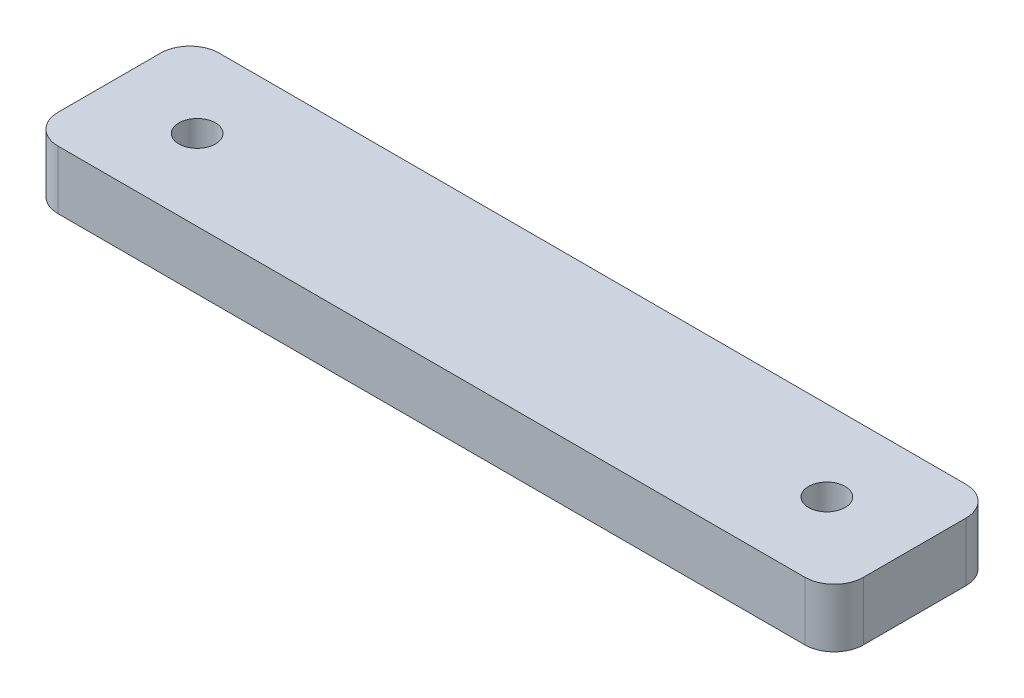
ISO-10303-21;
HEADER;
FILE_DESCRIPTION(('STEP AP214'),'2;1');
FILE_NAME('part.step','',(''),(''),'','','');
FILE_SCHEMA(('AUTOMOTIVE_DESIGN { 1 0 10303 214 1 1 1 1 }'));
ENDSEC;
DATA;
#1=APPLICATION_CONTEXT('core data for automotive mechanical design processes');
#2=APPLICATION_PROTOCOL_DEFINITION('international standard','automotive_design',2000,#1);
#3=PRODUCT_CONTEXT('',#1,'mechanical');
#4=PRODUCT('Part','Part','',(#3));
#5=PRODUCT_RELATED_PRODUCT_CATEGORY('part','',(#4));
#6=PRODUCT_DEFINITION_FORMATION('','',#4);
#7=PRODUCT_DEFINITION_CONTEXT('part definition',#1,'design');
#8=PRODUCT_DEFINITION('design','',#6,#7);
#9=PRODUCT_DEFINITION_SHAPE('','',#8);
#10=(LENGTH_UNIT() NAMED_UNIT(*) SI_UNIT(.MILLI.,.METRE.));
#11=(NAMED_UNIT(*) PLANE_ANGLE_UNIT() SI_UNIT($,.RADIAN.));
#12=(NAMED_UNIT(*) SI_UNIT($,.STERADIAN.) SOLID_ANGLE_UNIT());
#13=UNCERTAINTY_MEASURE_WITH_UNIT(LENGTH_MEASURE(1.E-05),#10,'distance_accuracy_value','');
#14=(GEOMETRIC_REPRESENTATION_CONTEXT(3) GLOBAL_UNCERTAINTY_ASSIGNED_CONTEXT((#13)) GLOBAL_UNIT_ASSIGNED_CONTEXT((#10,
#11,#12)) REPRESENTATION_CONTEXT('',''));
#15=CARTESIAN_POINT('',(0.,0.,0.));
#16=DIRECTION('',(0.,0.,1.));
#17=DIRECTION('',(1.,0.,0.));
#18=AXIS2_PLACEMENT_3D('',#15,#16,#17);
#19=CARTESIAN_POINT('',(0.,2.,0.));
#20=DIRECTION('',(0.,-1.,0.));
#21=DIRECTION('',(0.,0.,-1.));
#22=AXIS2_PLACEMENT_3D('',#19,#20,#21);
#23=PLANE('',#22);
#24=DIRECTION('',(0.,0.,-1.));
#25=VECTOR('',#24,1.);
#26=CARTESIAN_POINT('',(13.75,2.,2.75));
#27=LINE('',#26,#25);
#28=CARTESIAN_POINT('',(13.75,2.,1.75));
#29=VERTEX_POINT('',#28);
#30=CARTESIAN_POINT('',(13.75,2.,-1.75));
#31=VERTEX_POINT('',#30);
#32=EDGE_CURVE('E139',#29,#31,#27,.T.);
#33=ORIENTED_EDGE('',*,*,#32,.T.);
#34=CARTESIAN_POINT('',(12.75,2.,-1.75));
#35=DIRECTION('',(0.,-1.,0.));
#36=DIRECTION('',(0.,0.,-1.));
#37=AXIS2_PLACEMENT_3D('',#34,#35,#36);
#38=CIRCLE('',#37,1.);
#39=CARTESIAN_POINT('',(12.75,2.,-2.75));
#40=VERTEX_POINT('',#39);
#41=EDGE_CURVE('E153',#31,#40,#38,.F.);
#42=ORIENTED_EDGE('',*,*,#41,.T.);
#43=DIRECTION('',(-1.,0.,0.));
#44=VECTOR('',#43,1.);
#45=CARTESIAN_POINT('',(-13.75,2.,-2.75));
#46=LINE('',#45,#44);
#47=CARTESIAN_POINT('',(-12.75,2.,-2.75));
#48=VERTEX_POINT('',#47);
#49=EDGE_CURVE('E120',#40,#48,#46,.T.);
#50=ORIENTED_EDGE('',*,*,#49,.T.);
#51=CARTESIAN_POINT('',(-12.75,2.,-1.75));
#52=DIRECTION('',(0.,-1.,0.));
#53=DIRECTION('',(0.,0.,-1.));
#54=AXIS2_PLACEMENT_3D('',#51,#52,#53);
#55=CIRCLE('',#54,1.);
#56=CARTESIAN_POINT('',(-13.75,2.,-1.75));
#57=VERTEX_POINT('',#56);
#58=EDGE_CURVE('E149',#48,#57,#55,.F.);
#59=ORIENTED_EDGE('',*,*,#58,.T.);
#60=DIRECTION('',(0.,0.,1.));
#61=VECTOR('',#60,1.);
#62=CARTESIAN_POINT('',(-13.75,2.,2.75));
#63=LINE('',#62,#61);
#64=CARTESIAN_POINT('',(-13.75,2.,1.75));
#65=VERTEX_POINT('',#64);
#66=EDGE_CURVE('E162',#57,#65,#63,.T.);
#67=ORIENTED_EDGE('',*,*,#66,.T.);
#68=CARTESIAN_POINT('',(-12.75,2.,1.75));
#69=DIRECTION('',(0.,-1.,0.));
#70=DIRECTION('',(0.,0.,-1.));
#71=AXIS2_PLACEMENT_3D('',#68,#69,#70);
#72=CIRCLE('',#71,1.);
#73=CARTESIAN_POINT('',(-12.75,2.,2.75));
#74=VERTEX_POINT('',#73);
#75=EDGE_CURVE('E55',#65,#74,#72,.F.);
#76=ORIENTED_EDGE('',*,*,#75,.T.);
#77=DIRECTION('',(1.,0.,0.));
#78=VECTOR('',#77,1.);
#79=CARTESIAN_POINT('',(-13.75,2.,2.75));
#80=LINE('',#79,#78);
#81=CARTESIAN_POINT('',(12.75,2.,2.75));
#82=VERTEX_POINT('',#81);
#83=EDGE_CURVE('E140',#74,#82,#80,.T.);
#84=ORIENTED_EDGE('',*,*,#83,.T.);
#85=CARTESIAN_POINT('',(12.75,2.,1.75));
#86=DIRECTION('',(0.,-1.,0.));
#87=DIRECTION('',(0.,0.,-1.));
#88=AXIS2_PLACEMENT_3D('',#85,#86,#87);
#89=CIRCLE('',#88,1.);
#90=EDGE_CURVE('E151',#82,#29,#89,.F.);
#91=ORIENTED_EDGE('',*,*,#90,.T.);
#92=EDGE_LOOP('',(#33,#42,#50,#59,#67,#76,#84,#91));
#93=FACE_BOUND('',#92,.T.);
#94=CARTESIAN_POINT('',(-10.75,2.,0.));
#95=DIRECTION('',(0.,1.,0.));
#96=DIRECTION('',(0.,0.,1.));
#97=AXIS2_PLACEMENT_3D('',#94,#95,#96);
#98=CIRCLE('',#97,0.625000000000001);
#99=CARTESIAN_POINT('',(-10.75,2.,0.625000000000001));
#100=VERTEX_POINT('',#99);
#101=EDGE_CURVE('E134',#100,#100,#98,.T.);
#102=ORIENTED_EDGE('',*,*,#101,.F.);
#103=EDGE_LOOP('',(#102));
#104=FACE_BOUND('',#103,.T.);
#105=CARTESIAN_POINT('',(10.75,2.,0.));
#106=DIRECTION('',(0.,1.,0.));
#107=DIRECTION('',(0.,0.,-1.));
#108=AXIS2_PLACEMENT_3D('',#105,#106,#107);
#109=CIRCLE('',#108,0.625000000000001);
#110=CARTESIAN_POINT('',(10.75,2.,-0.625000000000001));
#111=VERTEX_POINT('',#110);
#112=EDGE_CURVE('E185',#111,#111,#109,.T.);
#113=ORIENTED_EDGE('',*,*,#112,.F.);
#114=EDGE_LOOP('',(#113));
#115=FACE_BOUND('',#114,.T.);
#116=ADVANCED_FACE('F33',(#93,#104,#115),#23,.F.);
#117=CARTESIAN_POINT('',(0.,0.,0.));
#118=DIRECTION('',(0.,-1.,0.));
#119=DIRECTION('',(0.,0.,-1.));
#120=AXIS2_PLACEMENT_3D('',#117,#118,#119);
#121=PLANE('',#120);
#122=CARTESIAN_POINT('',(-10.75,0.,0.));
#123=DIRECTION('',(0.,1.,0.));
#124=DIRECTION('',(0.,0.,1.));
#125=AXIS2_PLACEMENT_3D('',#122,#123,#124);
#126=CIRCLE('',#125,0.625000000000001);
#127=CARTESIAN_POINT('',(-10.75,0.,0.625000000000001));
#128=VERTEX_POINT('',#127);
#129=EDGE_CURVE('E182',#128,#128,#126,.T.);
#130=ORIENTED_EDGE('',*,*,#129,.T.);
#131=EDGE_LOOP('',(#130));
#132=FACE_BOUND('',#131,.T.);
#133=DIRECTION('',(-1.,0.,0.));
#134=VECTOR('',#133,1.);
#135=CARTESIAN_POINT('',(-13.75,0.,-2.75));
#136=LINE('',#135,#134);
#137=CARTESIAN_POINT('',(12.75,0.,-2.75));
#138=VERTEX_POINT('',#137);
#139=CARTESIAN_POINT('',(-12.75,0.,-2.75));
#140=VERTEX_POINT('',#139);
#141=EDGE_CURVE('E117',#138,#140,#136,.T.);
#142=ORIENTED_EDGE('',*,*,#141,.F.);
#143=CARTESIAN_POINT('',(12.75,0.,-1.75));
#144=DIRECTION('',(0.,-1.,0.));
#145=DIRECTION('',(0.,0.,-1.));
#146=AXIS2_PLACEMENT_3D('',#143,#144,#145);
#147=CIRCLE('',#146,1.);
#148=CARTESIAN_POINT('',(13.75,0.,-1.75));
#149=VERTEX_POINT('',#148);
#150=EDGE_CURVE('E100',#138,#149,#147,.T.);
#151=ORIENTED_EDGE('',*,*,#150,.T.);
#152=DIRECTION('',(0.,0.,-1.));
#153=VECTOR('',#152,1.);
#154=CARTESIAN_POINT('',(13.75,0.,2.75));
#155=LINE('',#154,#153);
#156=CARTESIAN_POINT('',(13.75,0.,1.75));
#157=VERTEX_POINT('',#156);
#158=EDGE_CURVE('E129',#157,#149,#155,.T.);
#159=ORIENTED_EDGE('',*,*,#158,.F.);
#160=CARTESIAN_POINT('',(12.75,0.,1.75));
#161=DIRECTION('',(0.,-1.,0.));
#162=DIRECTION('',(0.,0.,-1.));
#163=AXIS2_PLACEMENT_3D('',#160,#161,#162);
#164=CIRCLE('',#163,1.);
#165=CARTESIAN_POINT('',(12.75,0.,2.75));
#166=VERTEX_POINT('',#165);
#167=EDGE_CURVE('E111',#157,#166,#164,.T.);
#168=ORIENTED_EDGE('',*,*,#167,.T.);
#169=DIRECTION('',(1.,0.,0.));
#170=VECTOR('',#169,1.);
#171=CARTESIAN_POINT('',(-13.75,0.,2.75));
#172=LINE('',#171,#170);
#173=CARTESIAN_POINT('',(-12.75,0.,2.75));
#174=VERTEX_POINT('',#173);
#175=EDGE_CURVE('E132',#174,#166,#172,.T.);
#176=ORIENTED_EDGE('',*,*,#175,.F.);
#177=CARTESIAN_POINT('',(-12.75,0.,1.75));
#178=DIRECTION('',(0.,-1.,0.));
#179=DIRECTION('',(0.,0.,-1.));
#180=AXIS2_PLACEMENT_3D('',#177,#178,#179);
#181=CIRCLE('',#180,1.);
#182=CARTESIAN_POINT('',(-13.75,0.,1.75));
#183=VERTEX_POINT('',#182);
#184=EDGE_CURVE('E121',#174,#183,#181,.T.);
#185=ORIENTED_EDGE('',*,*,#184,.T.);
#186=DIRECTION('',(0.,0.,1.));
#187=VECTOR('',#186,1.);
#188=CARTESIAN_POINT('',(-13.75,0.,2.75));
#189=LINE('',#188,#187);
#190=CARTESIAN_POINT('',(-13.75,0.,-1.75));
#191=VERTEX_POINT('',#190);
#192=EDGE_CURVE('E128',#191,#183,#189,.T.);
#193=ORIENTED_EDGE('',*,*,#192,.F.);
#194=CARTESIAN_POINT('',(-12.75,0.,-1.75));
#195=DIRECTION('',(0.,-1.,0.));
#196=DIRECTION('',(0.,0.,-1.));
#197=AXIS2_PLACEMENT_3D('',#194,#195,#196);
#198=CIRCLE('',#197,1.);
#199=EDGE_CURVE('E127',#191,#140,#198,.T.);
#200=ORIENTED_EDGE('',*,*,#199,.T.);
#201=EDGE_LOOP('',(#142,#151,#159,#168,#176,#185,#193,#200));
#202=FACE_BOUND('',#201,.T.);
#203=CARTESIAN_POINT('',(10.75,0.,0.));
#204=DIRECTION('',(0.,1.,0.));
#205=DIRECTION('',(0.,0.,-1.));
#206=AXIS2_PLACEMENT_3D('',#203,#204,#205);
#207=CIRCLE('',#206,0.625000000000001);
#208=CARTESIAN_POINT('',(10.75,0.,-0.625000000000001));
#209=VERTEX_POINT('',#208);
#210=EDGE_CURVE('E188',#209,#209,#207,.T.);
#211=ORIENTED_EDGE('',*,*,#210,.T.);
#212=EDGE_LOOP('',(#211));
#213=FACE_BOUND('',#212,.T.);
#214=ADVANCED_FACE('F124',(#132,#202,#213),#121,.T.);
#215=CARTESIAN_POINT('',(13.75,2.,2.75));
#216=DIRECTION('',(-1.,0.,0.));
#217=DIRECTION('',(0.,0.,1.));
#218=AXIS2_PLACEMENT_3D('',#215,#216,#217);
#219=PLANE('',#218);
#220=ORIENTED_EDGE('',*,*,#158,.T.);
#221=DIRECTION('',(0.,-1.,0.));
#222=VECTOR('',#221,1.);
#223=CARTESIAN_POINT('',(13.75,2.,-1.75));
#224=LINE('',#223,#222);
#225=EDGE_CURVE('E105',#149,#31,#224,.F.);
#226=ORIENTED_EDGE('',*,*,#225,.T.);
#227=ORIENTED_EDGE('',*,*,#32,.F.);
#228=DIRECTION('',(0.,-1.,0.));
#229=VECTOR('',#228,1.);
#230=CARTESIAN_POINT('',(13.75,2.,1.75));
#231=LINE('',#230,#229);
#232=EDGE_CURVE('E110',#29,#157,#231,.T.);
#233=ORIENTED_EDGE('',*,*,#232,.T.);
#234=EDGE_LOOP('',(#220,#226,#227,#233));
#235=FACE_BOUND('',#234,.T.);
#236=ADVANCED_FACE('F178',(#235),#219,.F.);
#237=CARTESIAN_POINT('',(-13.75,2.,-2.75));
#238=DIRECTION('',(0.,0.,1.));
#239=DIRECTION('',(1.,0.,0.));
#240=AXIS2_PLACEMENT_3D('',#237,#238,#239);
#241=PLANE('',#240);
#242=ORIENTED_EDGE('',*,*,#49,.F.);
#243=DIRECTION('',(0.,-1.,0.));
#244=VECTOR('',#243,1.);
#245=CARTESIAN_POINT('',(12.75,2.,-2.75));
#246=LINE('',#245,#244);
#247=EDGE_CURVE('E104',#40,#138,#246,.T.);
#248=ORIENTED_EDGE('',*,*,#247,.T.);
#249=ORIENTED_EDGE('',*,*,#141,.T.);
#250=DIRECTION('',(0.,-1.,0.));
#251=VECTOR('',#250,1.);
#252=CARTESIAN_POINT('',(-12.75,2.,-2.75));
#253=LINE('',#252,#251);
#254=EDGE_CURVE('E122',#140,#48,#253,.F.);
#255=ORIENTED_EDGE('',*,*,#254,.T.);
#256=EDGE_LOOP('',(#242,#248,#249,#255));
#257=FACE_BOUND('',#256,.T.);
#258=ADVANCED_FACE('F116',(#257),#241,.F.);
#259=CARTESIAN_POINT('',(-13.75,2.,2.75));
#260=DIRECTION('',(1.,0.,0.));
#261=DIRECTION('',(0.,0.,-1.));
#262=AXIS2_PLACEMENT_3D('',#259,#260,#261);
#263=PLANE('',#262);
#264=ORIENTED_EDGE('',*,*,#66,.F.);
#265=DIRECTION('',(0.,-1.,0.));
#266=VECTOR('',#265,1.);
#267=CARTESIAN_POINT('',(-13.75,2.,-1.75));
#268=LINE('',#267,#266);
#269=EDGE_CURVE('E11',#57,#191,#268,.T.);
#270=ORIENTED_EDGE('',*,*,#269,.T.);
#271=ORIENTED_EDGE('',*,*,#192,.T.);
#272=DIRECTION('',(0.,-1.,0.));
#273=VECTOR('',#272,1.);
#274=CARTESIAN_POINT('',(-13.75,2.,1.75));
#275=LINE('',#274,#273);
#276=EDGE_CURVE('E41',#183,#65,#275,.F.);
#277=ORIENTED_EDGE('',*,*,#276,.T.);
#278=EDGE_LOOP('',(#264,#270,#271,#277));
#279=FACE_BOUND('',#278,.T.);
#280=ADVANCED_FACE('F161',(#279),#263,.F.);
#281=CARTESIAN_POINT('',(-13.75,2.,2.75));
#282=DIRECTION('',(0.,0.,-1.));
#283=DIRECTION('',(-1.,0.,0.));
#284=AXIS2_PLACEMENT_3D('',#281,#282,#283);
#285=PLANE('',#284);
#286=ORIENTED_EDGE('',*,*,#175,.T.);
#287=DIRECTION('',(0.,-1.,0.));
#288=VECTOR('',#287,1.);
#289=CARTESIAN_POINT('',(12.75,2.,2.75));
#290=LINE('',#289,#288);
#291=EDGE_CURVE('E48',#166,#82,#290,.F.);
#292=ORIENTED_EDGE('',*,*,#291,.T.);
#293=ORIENTED_EDGE('',*,*,#83,.F.);
#294=DIRECTION('',(0.,-1.,0.));
#295=VECTOR('',#294,1.);
#296=CARTESIAN_POINT('',(-12.75,2.,2.75));
#297=LINE('',#296,#295);
#298=EDGE_CURVE('E155',#74,#174,#297,.T.);
#299=ORIENTED_EDGE('',*,*,#298,.T.);
#300=EDGE_LOOP('',(#286,#292,#293,#299));
#301=FACE_BOUND('',#300,.T.);
#302=ADVANCED_FACE('F171',(#301),#285,.F.);
#303=CARTESIAN_POINT('',(-10.75,2.,0.));
#304=DIRECTION('',(0.,-1.,0.));
#305=DIRECTION('',(0.,0.,-1.));
#306=AXIS2_PLACEMENT_3D('',#303,#304,#305);
#307=CYLINDRICAL_SURFACE('',#306,0.625000000000001);
#308=ORIENTED_EDGE('',*,*,#101,.T.);
#309=EDGE_LOOP('',(#308));
#310=FACE_BOUND('',#309,.T.);
#311=ORIENTED_EDGE('',*,*,#129,.F.);
#312=EDGE_LOOP('',(#311));
#313=FACE_BOUND('',#312,.T.);
#314=ADVANCED_FACE('F205',(#310,#313),#307,.F.);
#315=CARTESIAN_POINT('',(10.75,2.,0.));
#316=DIRECTION('',(0.,-1.,0.));
#317=DIRECTION('',(0.,0.,-1.));
#318=AXIS2_PLACEMENT_3D('',#315,#316,#317);
#319=CYLINDRICAL_SURFACE('',#318,0.625000000000001);
#320=ORIENTED_EDGE('',*,*,#112,.T.);
#321=EDGE_LOOP('',(#320));
#322=FACE_BOUND('',#321,.T.);
#323=ORIENTED_EDGE('',*,*,#210,.F.);
#324=EDGE_LOOP('',(#323));
#325=FACE_BOUND('',#324,.T.);
#326=ADVANCED_FACE('F194',(#322,#325),#319,.F.);
#327=CARTESIAN_POINT('',(12.75,2.,-1.75));
#328=DIRECTION('',(0.,-1.,0.));
#329=DIRECTION('',(0.,0.,-1.));
#330=AXIS2_PLACEMENT_3D('',#327,#328,#329);
#331=CYLINDRICAL_SURFACE('',#330,1.);
#332=ORIENTED_EDGE('',*,*,#41,.F.);
#333=ORIENTED_EDGE('',*,*,#225,.F.);
#334=ORIENTED_EDGE('',*,*,#150,.F.);
#335=ORIENTED_EDGE('',*,*,#247,.F.);
#336=EDGE_LOOP('',(#332,#333,#334,#335));
#337=FACE_BOUND('',#336,.T.);
#338=ADVANCED_FACE('F103',(#337),#331,.T.);
#339=CARTESIAN_POINT('',(12.75,2.,1.75));
#340=DIRECTION('',(0.,-1.,0.));
#341=DIRECTION('',(0.,0.,-1.));
#342=AXIS2_PLACEMENT_3D('',#339,#340,#341);
#343=CYLINDRICAL_SURFACE('',#342,1.);
#344=ORIENTED_EDGE('',*,*,#90,.F.);
#345=ORIENTED_EDGE('',*,*,#291,.F.);
#346=ORIENTED_EDGE('',*,*,#167,.F.);
#347=ORIENTED_EDGE('',*,*,#232,.F.);
#348=EDGE_LOOP('',(#344,#345,#346,#347));
#349=FACE_BOUND('',#348,.T.);
#350=ADVANCED_FACE('F175',(#349),#343,.T.);
#351=CARTESIAN_POINT('',(-12.75,2.,-1.75));
#352=DIRECTION('',(0.,-1.,0.));
#353=DIRECTION('',(0.,0.,-1.));
#354=AXIS2_PLACEMENT_3D('',#351,#352,#353);
#355=CYLINDRICAL_SURFACE('',#354,1.);
#356=ORIENTED_EDGE('',*,*,#58,.F.);
#357=ORIENTED_EDGE('',*,*,#254,.F.);
#358=ORIENTED_EDGE('',*,*,#199,.F.);
#359=ORIENTED_EDGE('',*,*,#269,.F.);
#360=EDGE_LOOP('',(#356,#357,#358,#359));
#361=FACE_BOUND('',#360,.T.);
#362=ADVANCED_FACE('F219',(#361),#355,.T.);
#363=CARTESIAN_POINT('',(-12.75,2.,1.75));
#364=DIRECTION('',(0.,-1.,0.));
#365=DIRECTION('',(0.,0.,-1.));
#366=AXIS2_PLACEMENT_3D('',#363,#364,#365);
#367=CYLINDRICAL_SURFACE('',#366,1.);
#368=ORIENTED_EDGE('',*,*,#75,.F.);
#369=ORIENTED_EDGE('',*,*,#276,.F.);
#370=ORIENTED_EDGE('',*,*,#184,.F.);
#371=ORIENTED_EDGE('',*,*,#298,.F.);
#372=EDGE_LOOP('',(#368,#369,#370,#371));
#373=FACE_BOUND('',#372,.T.);
#374=ADVANCED_FACE('F35',(#373),#367,.T.);
#375=CLOSED_SHELL('',(#116,#214,#236,#258,#280,#302,#314,#326,#338,#350,#362,#374));
#376=MANIFOLD_SOLID_BREP('B2',#375);
#377=ADVANCED_BREP_SHAPE_REPRESENTATION('',(#18,#376),#14);
#378=SHAPE_DEFINITION_REPRESENTATION(#9,#377);
ENDSEC;
END-ISO-10303-21;
